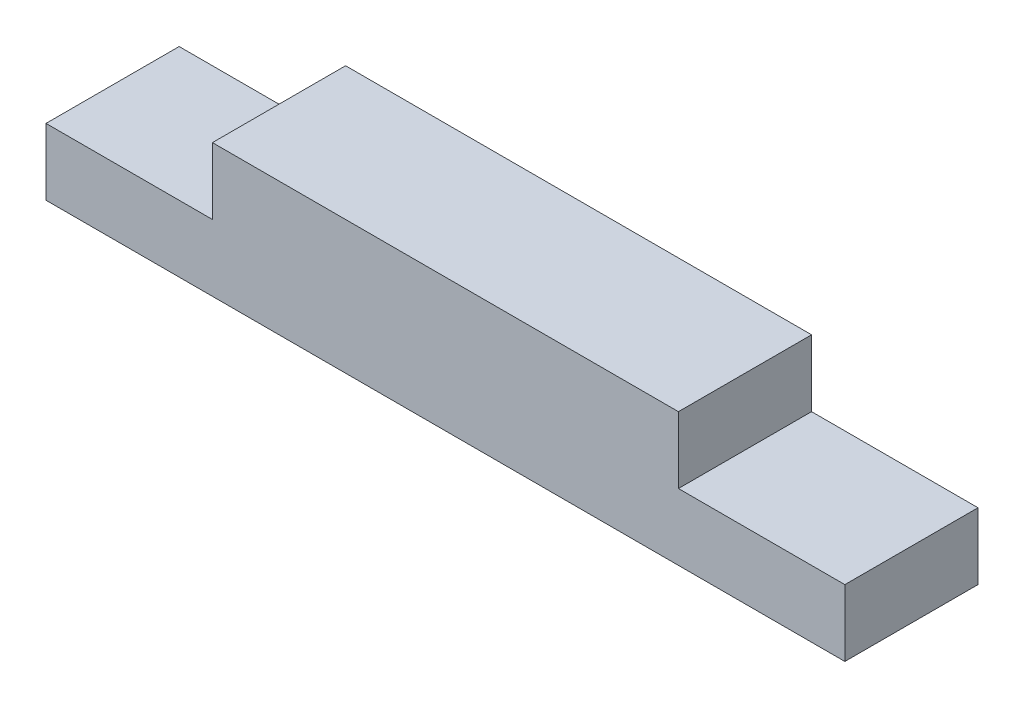
ISO-10303-21;
HEADER;
FILE_DESCRIPTION(('STEP AP214'),'2;1');
FILE_NAME('part.step','',(''),(''),'','','');
FILE_SCHEMA(('AUTOMOTIVE_DESIGN { 1 0 10303 214 1 1 1 1 }'));
ENDSEC;
DATA;
#1=APPLICATION_CONTEXT('core data for automotive mechanical design processes');
#2=APPLICATION_PROTOCOL_DEFINITION('international standard','automotive_design',2000,#1);
#3=PRODUCT_CONTEXT('',#1,'mechanical');
#4=PRODUCT('Part','Part','',(#3));
#5=PRODUCT_RELATED_PRODUCT_CATEGORY('part','',(#4));
#6=PRODUCT_DEFINITION_FORMATION('','',#4);
#7=PRODUCT_DEFINITION_CONTEXT('part definition',#1,'design');
#8=PRODUCT_DEFINITION('design','',#6,#7);
#9=PRODUCT_DEFINITION_SHAPE('','',#8);
#10=(LENGTH_UNIT() NAMED_UNIT(*) SI_UNIT(.MILLI.,.METRE.));
#11=(NAMED_UNIT(*) PLANE_ANGLE_UNIT() SI_UNIT($,.RADIAN.));
#12=(NAMED_UNIT(*) SI_UNIT($,.STERADIAN.) SOLID_ANGLE_UNIT());
#13=UNCERTAINTY_MEASURE_WITH_UNIT(LENGTH_MEASURE(1.E-05),#10,'distance_accuracy_value','');
#14=(GEOMETRIC_REPRESENTATION_CONTEXT(3) GLOBAL_UNCERTAINTY_ASSIGNED_CONTEXT((#13)) GLOBAL_UNIT_ASSIGNED_CONTEXT((#10,
#11,#12)) REPRESENTATION_CONTEXT('',''));
#15=CARTESIAN_POINT('',(0.,0.,0.));
#16=DIRECTION('',(0.,0.,1.));
#17=DIRECTION('',(1.,0.,0.));
#18=AXIS2_PLACEMENT_3D('',#15,#16,#17);
#19=CARTESIAN_POINT('',(0.,20.,0.));
#20=DIRECTION('',(0.,0.,-1.));
#21=DIRECTION('',(-1.,0.,0.));
#22=AXIS2_PLACEMENT_3D('',#19,#20,#21);
#23=PLANE('',#22);
#24=DIRECTION('',(0.,-1.,0.));
#25=VECTOR('',#24,1.);
#26=CARTESIAN_POINT('',(25.,0.,0.));
#27=LINE('',#26,#25);
#28=CARTESIAN_POINT('',(25.,20.,0.));
#29=VERTEX_POINT('',#28);
#30=CARTESIAN_POINT('',(25.,10.,0.));
#31=VERTEX_POINT('',#30);
#32=EDGE_CURVE('E114',#29,#31,#27,.T.);
#33=ORIENTED_EDGE('',*,*,#32,.T.);
#34=DIRECTION('',(1.,0.,0.));
#35=VECTOR('',#34,1.);
#36=CARTESIAN_POINT('',(0.,10.,0.));
#37=LINE('',#36,#35);
#38=CARTESIAN_POINT('',(0.,10.,0.));
#39=VERTEX_POINT('',#38);
#40=EDGE_CURVE('E171',#39,#31,#37,.T.);
#41=ORIENTED_EDGE('',*,*,#40,.F.);
#42=DIRECTION('',(0.,-1.,0.));
#43=VECTOR('',#42,1.);
#44=CARTESIAN_POINT('',(0.,20.,0.));
#45=LINE('',#44,#43);
#46=CARTESIAN_POINT('',(0.,0.,0.));
#47=VERTEX_POINT('',#46);
#48=EDGE_CURVE('E12',#39,#47,#45,.T.);
#49=ORIENTED_EDGE('',*,*,#48,.T.);
#50=DIRECTION('',(1.,0.,0.));
#51=VECTOR('',#50,1.);
#52=CARTESIAN_POINT('',(0.,0.,0.));
#53=LINE('',#52,#51);
#54=CARTESIAN_POINT('',(120.,0.,0.));
#55=VERTEX_POINT('',#54);
#56=EDGE_CURVE('E193',#47,#55,#53,.T.);
#57=ORIENTED_EDGE('',*,*,#56,.T.);
#58=DIRECTION('',(0.,-1.,0.));
#59=VECTOR('',#58,1.);
#60=CARTESIAN_POINT('',(120.,20.,0.));
#61=LINE('',#60,#59);
#62=CARTESIAN_POINT('',(120.,10.,0.));
#63=VERTEX_POINT('',#62);
#64=EDGE_CURVE('E98',#63,#55,#61,.T.);
#65=ORIENTED_EDGE('',*,*,#64,.F.);
#66=DIRECTION('',(-1.,0.,0.));
#67=VECTOR('',#66,1.);
#68=CARTESIAN_POINT('',(0.,9.99999999999998,0.));
#69=LINE('',#68,#67);
#70=CARTESIAN_POINT('',(95.,10.,0.));
#71=VERTEX_POINT('',#70);
#72=EDGE_CURVE('E233',#63,#71,#69,.T.);
#73=ORIENTED_EDGE('',*,*,#72,.T.);
#74=DIRECTION('',(0.,-1.,0.));
#75=VECTOR('',#74,1.);
#76=CARTESIAN_POINT('',(95.,0.,0.));
#77=LINE('',#76,#75);
#78=CARTESIAN_POINT('',(95.,20.,0.));
#79=VERTEX_POINT('',#78);
#80=EDGE_CURVE('E237',#79,#71,#77,.T.);
#81=ORIENTED_EDGE('',*,*,#80,.F.);
#82=DIRECTION('',(1.,0.,0.));
#83=VECTOR('',#82,1.);
#84=CARTESIAN_POINT('',(0.,20.,0.));
#85=LINE('',#84,#83);
#86=EDGE_CURVE('E178',#29,#79,#85,.T.);
#87=ORIENTED_EDGE('',*,*,#86,.F.);
#88=EDGE_LOOP('',(#33,#41,#49,#57,#65,#73,#81,#87));
#89=FACE_BOUND('',#88,.T.);
#90=ADVANCED_FACE('F90',(#89),#23,.F.);
#91=CARTESIAN_POINT('',(120.,20.,0.));
#92=DIRECTION('',(-1.,0.,0.));
#93=DIRECTION('',(0.,0.,1.));
#94=AXIS2_PLACEMENT_3D('',#91,#92,#93);
#95=PLANE('',#94);
#96=DIRECTION('',(0.,0.,1.));
#97=VECTOR('',#96,1.);
#98=CARTESIAN_POINT('',(120.,10.,-20.));
#99=LINE('',#98,#97);
#100=CARTESIAN_POINT('',(120.,10.,-20.));
#101=VERTEX_POINT('',#100);
#102=EDGE_CURVE('E214',#101,#63,#99,.T.);
#103=ORIENTED_EDGE('',*,*,#102,.T.);
#104=ORIENTED_EDGE('',*,*,#64,.T.);
#105=DIRECTION('',(0.,0.,-1.));
#106=VECTOR('',#105,1.);
#107=CARTESIAN_POINT('',(120.,0.,0.));
#108=LINE('',#107,#106);
#109=CARTESIAN_POINT('',(120.,0.,-20.));
#110=VERTEX_POINT('',#109);
#111=EDGE_CURVE('E196',#55,#110,#108,.T.);
#112=ORIENTED_EDGE('',*,*,#111,.T.);
#113=DIRECTION('',(0.,-1.,0.));
#114=VECTOR('',#113,1.);
#115=CARTESIAN_POINT('',(120.,20.,-20.));
#116=LINE('',#115,#114);
#117=EDGE_CURVE('E181',#101,#110,#116,.T.);
#118=ORIENTED_EDGE('',*,*,#117,.F.);
#119=EDGE_LOOP('',(#103,#104,#112,#118));
#120=FACE_BOUND('',#119,.T.);
#121=ADVANCED_FACE('F211',(#120),#95,.F.);
#122=CARTESIAN_POINT('',(0.,20.,-20.));
#123=DIRECTION('',(0.,0.,1.));
#124=DIRECTION('',(1.,0.,0.));
#125=AXIS2_PLACEMENT_3D('',#122,#123,#124);
#126=PLANE('',#125);
#127=CARTESIAN_POINT('',(60.,10.,-20.));
#128=DIRECTION('',(0.,0.,-1.));
#129=DIRECTION('',(-1.,0.,0.));
#130=AXIS2_PLACEMENT_3D('',#127,#128,#129);
#131=CIRCLE('',#130,4.25000000000001);
#132=CARTESIAN_POINT('',(55.75,10.,-20.));
#133=VERTEX_POINT('',#132);
#134=EDGE_CURVE('E319',#133,#133,#131,.T.);
#135=ORIENTED_EDGE('',*,*,#134,.F.);
#136=EDGE_LOOP('',(#135));
#137=FACE_BOUND('',#136,.T.);
#138=DIRECTION('',(0.,-1.,0.));
#139=VECTOR('',#138,1.);
#140=CARTESIAN_POINT('',(25.,0.,-20.));
#141=LINE('',#140,#139);
#142=CARTESIAN_POINT('',(25.,20.,-20.));
#143=VERTEX_POINT('',#142);
#144=CARTESIAN_POINT('',(25.,10.,-20.));
#145=VERTEX_POINT('',#144);
#146=EDGE_CURVE('E154',#143,#145,#141,.T.);
#147=ORIENTED_EDGE('',*,*,#146,.F.);
#148=DIRECTION('',(-1.,0.,0.));
#149=VECTOR('',#148,1.);
#150=CARTESIAN_POINT('',(0.,20.,-20.));
#151=LINE('',#150,#149);
#152=CARTESIAN_POINT('',(95.,20.,-20.));
#153=VERTEX_POINT('',#152);
#154=EDGE_CURVE('E166',#153,#143,#151,.T.);
#155=ORIENTED_EDGE('',*,*,#154,.F.);
#156=DIRECTION('',(0.,-1.,0.));
#157=VECTOR('',#156,1.);
#158=CARTESIAN_POINT('',(95.,0.,-20.));
#159=LINE('',#158,#157);
#160=CARTESIAN_POINT('',(95.,10.,-20.));
#161=VERTEX_POINT('',#160);
#162=EDGE_CURVE('E104',#153,#161,#159,.T.);
#163=ORIENTED_EDGE('',*,*,#162,.T.);
#164=DIRECTION('',(-1.,0.,0.));
#165=VECTOR('',#164,1.);
#166=CARTESIAN_POINT('',(0.,9.99999999999998,-20.));
#167=LINE('',#166,#165);
#168=EDGE_CURVE('E223',#101,#161,#167,.T.);
#169=ORIENTED_EDGE('',*,*,#168,.F.);
#170=ORIENTED_EDGE('',*,*,#117,.T.);
#171=DIRECTION('',(-1.,0.,0.));
#172=VECTOR('',#171,1.);
#173=CARTESIAN_POINT('',(0.,0.,-20.));
#174=LINE('',#173,#172);
#175=CARTESIAN_POINT('',(0.,0.,-20.));
#176=VERTEX_POINT('',#175);
#177=EDGE_CURVE('E183',#110,#176,#174,.T.);
#178=ORIENTED_EDGE('',*,*,#177,.T.);
#179=DIRECTION('',(0.,-1.,0.));
#180=VECTOR('',#179,1.);
#181=CARTESIAN_POINT('',(0.,20.,-20.));
#182=LINE('',#181,#180);
#183=CARTESIAN_POINT('',(0.,10.,-20.));
#184=VERTEX_POINT('',#183);
#185=EDGE_CURVE('E180',#184,#176,#182,.T.);
#186=ORIENTED_EDGE('',*,*,#185,.F.);
#187=DIRECTION('',(1.,0.,0.));
#188=VECTOR('',#187,1.);
#189=CARTESIAN_POINT('',(0.,10.,-20.));
#190=LINE('',#189,#188);
#191=EDGE_CURVE('E162',#184,#145,#190,.T.);
#192=ORIENTED_EDGE('',*,*,#191,.T.);
#193=EDGE_LOOP('',(#147,#155,#163,#169,#170,#178,#186,#192));
#194=FACE_BOUND('',#193,.T.);
#195=ADVANCED_FACE('F169',(#137,#194),#126,.F.);
#196=CARTESIAN_POINT('',(0.,20.,0.));
#197=DIRECTION('',(0.,-1.,0.));
#198=DIRECTION('',(0.,0.,-1.));
#199=AXIS2_PLACEMENT_3D('',#196,#197,#198);
#200=PLANE('',#199);
#201=DIRECTION('',(0.,0.,1.));
#202=VECTOR('',#201,1.);
#203=CARTESIAN_POINT('',(25.,20.,-20.));
#204=LINE('',#203,#202);
#205=EDGE_CURVE('E155',#143,#29,#204,.T.);
#206=ORIENTED_EDGE('',*,*,#205,.T.);
#207=ORIENTED_EDGE('',*,*,#86,.T.);
#208=DIRECTION('',(0.,0.,1.));
#209=VECTOR('',#208,1.);
#210=CARTESIAN_POINT('',(95.,20.,-20.));
#211=LINE('',#210,#209);
#212=EDGE_CURVE('E172',#153,#79,#211,.T.);
#213=ORIENTED_EDGE('',*,*,#212,.F.);
#214=ORIENTED_EDGE('',*,*,#154,.T.);
#215=EDGE_LOOP('',(#206,#207,#213,#214));
#216=FACE_BOUND('',#215,.T.);
#217=ADVANCED_FACE('F173',(#216),#200,.F.);
#218=CARTESIAN_POINT('',(0.,20.,0.));
#219=DIRECTION('',(1.,0.,0.));
#220=DIRECTION('',(0.,0.,-1.));
#221=AXIS2_PLACEMENT_3D('',#218,#219,#220);
#222=PLANE('',#221);
#223=ORIENTED_EDGE('',*,*,#48,.F.);
#224=DIRECTION('',(0.,0.,1.));
#225=VECTOR('',#224,1.);
#226=CARTESIAN_POINT('',(0.,10.,-20.));
#227=LINE('',#226,#225);
#228=EDGE_CURVE('E165',#184,#39,#227,.T.);
#229=ORIENTED_EDGE('',*,*,#228,.F.);
#230=ORIENTED_EDGE('',*,*,#185,.T.);
#231=DIRECTION('',(0.,0.,1.));
#232=VECTOR('',#231,1.);
#233=CARTESIAN_POINT('',(0.,0.,0.));
#234=LINE('',#233,#232);
#235=EDGE_CURVE('E188',#176,#47,#234,.T.);
#236=ORIENTED_EDGE('',*,*,#235,.T.);
#237=EDGE_LOOP('',(#223,#229,#230,#236));
#238=FACE_BOUND('',#237,.T.);
#239=ADVANCED_FACE('F93',(#238),#222,.F.);
#240=CARTESIAN_POINT('',(0.,0.,0.));
#241=DIRECTION('',(0.,-1.,0.));
#242=DIRECTION('',(0.,0.,-1.));
#243=AXIS2_PLACEMENT_3D('',#240,#241,#242);
#244=PLANE('',#243);
#245=CARTESIAN_POINT('',(80.,0.,-10.));
#246=DIRECTION('',(0.,-1.,0.));
#247=DIRECTION('',(0.,0.,-1.));
#248=AXIS2_PLACEMENT_3D('',#245,#246,#247);
#249=CIRCLE('',#248,2.25);
#250=CARTESIAN_POINT('',(80.,0.,-12.25));
#251=VERTEX_POINT('',#250);
#252=EDGE_CURVE('E321',#251,#251,#249,.T.);
#253=ORIENTED_EDGE('',*,*,#252,.F.);
#254=EDGE_LOOP('',(#253));
#255=FACE_BOUND('',#254,.T.);
#256=CARTESIAN_POINT('',(40.,0.,-10.));
#257=DIRECTION('',(0.,-1.,0.));
#258=DIRECTION('',(0.,0.,-1.));
#259=AXIS2_PLACEMENT_3D('',#256,#257,#258);
#260=CIRCLE('',#259,2.25);
#261=CARTESIAN_POINT('',(40.,0.,-12.25));
#262=VERTEX_POINT('',#261);
#263=EDGE_CURVE('E333',#262,#262,#260,.T.);
#264=ORIENTED_EDGE('',*,*,#263,.F.);
#265=EDGE_LOOP('',(#264));
#266=FACE_BOUND('',#265,.T.);
#267=ORIENTED_EDGE('',*,*,#235,.F.);
#268=ORIENTED_EDGE('',*,*,#177,.F.);
#269=ORIENTED_EDGE('',*,*,#111,.F.);
#270=ORIENTED_EDGE('',*,*,#56,.F.);
#271=EDGE_LOOP('',(#267,#268,#269,#270));
#272=FACE_BOUND('',#271,.T.);
#273=ADVANCED_FACE('F224',(#255,#266,#272),#244,.T.);
#274=CARTESIAN_POINT('',(0.,9.99999999999998,-20.));
#275=DIRECTION('',(0.,1.,0.));
#276=DIRECTION('',(-1.,0.,0.));
#277=AXIS2_PLACEMENT_3D('',#274,#275,#276);
#278=PLANE('',#277);
#279=ORIENTED_EDGE('',*,*,#72,.F.);
#280=ORIENTED_EDGE('',*,*,#102,.F.);
#281=ORIENTED_EDGE('',*,*,#168,.T.);
#282=DIRECTION('',(0.,0.,1.));
#283=VECTOR('',#282,1.);
#284=CARTESIAN_POINT('',(95.,10.,-20.));
#285=LINE('',#284,#283);
#286=EDGE_CURVE('E235',#161,#71,#285,.T.);
#287=ORIENTED_EDGE('',*,*,#286,.T.);
#288=EDGE_LOOP('',(#279,#280,#281,#287));
#289=FACE_BOUND('',#288,.T.);
#290=ADVANCED_FACE('F250',(#289),#278,.T.);
#291=CARTESIAN_POINT('',(95.,0.,-20.));
#292=DIRECTION('',(-1.,0.,0.));
#293=DIRECTION('',(0.,0.,1.));
#294=AXIS2_PLACEMENT_3D('',#291,#292,#293);
#295=PLANE('',#294);
#296=ORIENTED_EDGE('',*,*,#80,.T.);
#297=ORIENTED_EDGE('',*,*,#286,.F.);
#298=ORIENTED_EDGE('',*,*,#162,.F.);
#299=ORIENTED_EDGE('',*,*,#212,.T.);
#300=EDGE_LOOP('',(#296,#297,#298,#299));
#301=FACE_BOUND('',#300,.T.);
#302=ADVANCED_FACE('F247',(#301),#295,.F.);
#303=CARTESIAN_POINT('',(25.,0.,-20.));
#304=DIRECTION('',(-1.,0.,0.));
#305=DIRECTION('',(0.,-1.,0.));
#306=AXIS2_PLACEMENT_3D('',#303,#304,#305);
#307=PLANE('',#306);
#308=ORIENTED_EDGE('',*,*,#32,.F.);
#309=ORIENTED_EDGE('',*,*,#205,.F.);
#310=ORIENTED_EDGE('',*,*,#146,.T.);
#311=DIRECTION('',(0.,0.,1.));
#312=VECTOR('',#311,1.);
#313=CARTESIAN_POINT('',(25.,10.,-20.));
#314=LINE('',#313,#312);
#315=EDGE_CURVE('E192',#145,#31,#314,.T.);
#316=ORIENTED_EDGE('',*,*,#315,.T.);
#317=EDGE_LOOP('',(#308,#309,#310,#316));
#318=FACE_BOUND('',#317,.T.);
#319=ADVANCED_FACE('F152',(#318),#307,.T.);
#320=CARTESIAN_POINT('',(0.,10.,-20.));
#321=DIRECTION('',(0.,-1.,0.));
#322=DIRECTION('',(0.,0.,-1.));
#323=AXIS2_PLACEMENT_3D('',#320,#321,#322);
#324=PLANE('',#323);
#325=ORIENTED_EDGE('',*,*,#40,.T.);
#326=ORIENTED_EDGE('',*,*,#315,.F.);
#327=ORIENTED_EDGE('',*,*,#191,.F.);
#328=ORIENTED_EDGE('',*,*,#228,.T.);
#329=EDGE_LOOP('',(#325,#326,#327,#328));
#330=FACE_BOUND('',#329,.T.);
#331=ADVANCED_FACE('F262',(#330),#324,.F.);
#332=CARTESIAN_POINT('',(60.,10.,-10.));
#333=DIRECTION('',(0.,0.,-1.));
#334=DIRECTION('',(-1.,0.,0.));
#335=AXIS2_PLACEMENT_3D('',#332,#333,#334);
#336=CYLINDRICAL_SURFACE('',#335,4.25000000000001);
#337=CARTESIAN_POINT('',(60.,10.,-10.));
#338=DIRECTION('',(0.,0.,-1.));
#339=DIRECTION('',(-1.,0.,0.));
#340=AXIS2_PLACEMENT_3D('',#337,#338,#339);
#341=CIRCLE('',#340,4.25000000000001);
#342=CARTESIAN_POINT('',(55.75,10.,-10.));
#343=VERTEX_POINT('',#342);
#344=EDGE_CURVE('E238',#343,#343,#341,.T.);
#345=ORIENTED_EDGE('',*,*,#344,.F.);
#346=EDGE_LOOP('',(#345));
#347=FACE_BOUND('',#346,.T.);
#348=ORIENTED_EDGE('',*,*,#134,.T.);
#349=EDGE_LOOP('',(#348));
#350=FACE_BOUND('',#349,.T.);
#351=ADVANCED_FACE('F292',(#347,#350),#336,.F.);
#352=CARTESIAN_POINT('',(0.,0.,-10.));
#353=DIRECTION('',(0.,0.,-1.));
#354=DIRECTION('',(-1.,0.,0.));
#355=AXIS2_PLACEMENT_3D('',#352,#353,#354);
#356=PLANE('',#355);
#357=ORIENTED_EDGE('',*,*,#344,.T.);
#358=EDGE_LOOP('',(#357));
#359=FACE_BOUND('',#358,.T.);
#360=ADVANCED_FACE('F294',(#359),#356,.T.);
#361=CARTESIAN_POINT('',(40.,10.,-10.));
#362=DIRECTION('',(0.,-1.,0.));
#363=DIRECTION('',(0.,0.,-1.));
#364=AXIS2_PLACEMENT_3D('',#361,#362,#363);
#365=CYLINDRICAL_SURFACE('',#364,2.25);
#366=CARTESIAN_POINT('',(40.,10.,-10.));
#367=DIRECTION('',(0.,-1.,0.));
#368=DIRECTION('',(0.,0.,-1.));
#369=AXIS2_PLACEMENT_3D('',#366,#367,#368);
#370=CIRCLE('',#369,2.25);
#371=CARTESIAN_POINT('',(40.,10.,-12.25));
#372=VERTEX_POINT('',#371);
#373=EDGE_CURVE('E328',#372,#372,#370,.T.);
#374=ORIENTED_EDGE('',*,*,#373,.F.);
#375=EDGE_LOOP('',(#374));
#376=FACE_BOUND('',#375,.T.);
#377=ORIENTED_EDGE('',*,*,#263,.T.);
#378=EDGE_LOOP('',(#377));
#379=FACE_BOUND('',#378,.T.);
#380=ADVANCED_FACE('F300',(#376,#379),#365,.F.);
#381=CARTESIAN_POINT('',(0.,10.,0.));
#382=DIRECTION('',(0.,-1.,0.));
#383=DIRECTION('',(0.,0.,-1.));
#384=AXIS2_PLACEMENT_3D('',#381,#382,#383);
#385=PLANE('',#384);
#386=ORIENTED_EDGE('',*,*,#373,.T.);
#387=EDGE_LOOP('',(#386));
#388=FACE_BOUND('',#387,.T.);
#389=ADVANCED_FACE('F305',(#388),#385,.T.);
#390=CARTESIAN_POINT('',(80.,10.,-10.));
#391=DIRECTION('',(0.,-1.,0.));
#392=DIRECTION('',(0.,0.,-1.));
#393=AXIS2_PLACEMENT_3D('',#390,#391,#392);
#394=CYLINDRICAL_SURFACE('',#393,2.25);
#395=CARTESIAN_POINT('',(80.,10.,-10.));
#396=DIRECTION('',(0.,-1.,0.));
#397=DIRECTION('',(0.,0.,-1.));
#398=AXIS2_PLACEMENT_3D('',#395,#396,#397);
#399=CIRCLE('',#398,2.25);
#400=CARTESIAN_POINT('',(80.,10.,-12.25));
#401=VERTEX_POINT('',#400);
#402=EDGE_CURVE('E318',#401,#401,#399,.T.);
#403=ORIENTED_EDGE('',*,*,#402,.F.);
#404=EDGE_LOOP('',(#403));
#405=FACE_BOUND('',#404,.T.);
#406=ORIENTED_EDGE('',*,*,#252,.T.);
#407=EDGE_LOOP('',(#406));
#408=FACE_BOUND('',#407,.T.);
#409=ADVANCED_FACE('F308',(#405,#408),#394,.F.);
#410=CARTESIAN_POINT('',(0.,10.,0.));
#411=DIRECTION('',(0.,-1.,0.));
#412=DIRECTION('',(0.,0.,-1.));
#413=AXIS2_PLACEMENT_3D('',#410,#411,#412);
#414=PLANE('',#413);
#415=ORIENTED_EDGE('',*,*,#402,.T.);
#416=EDGE_LOOP('',(#415));
#417=FACE_BOUND('',#416,.T.);
#418=ADVANCED_FACE('F309',(#417),#414,.T.);
#419=CLOSED_SHELL('',(#90,#121,#195,#217,#239,#273,#290,#302,#319,#331,#351,#360,#380,#389,#409,#418));
#420=MANIFOLD_SOLID_BREP('B2',#419);
#421=ADVANCED_BREP_SHAPE_REPRESENTATION('',(#18,#420),#14);
#422=SHAPE_DEFINITION_REPRESENTATION(#9,#421);
ENDSEC;
END-ISO-10303-21;
